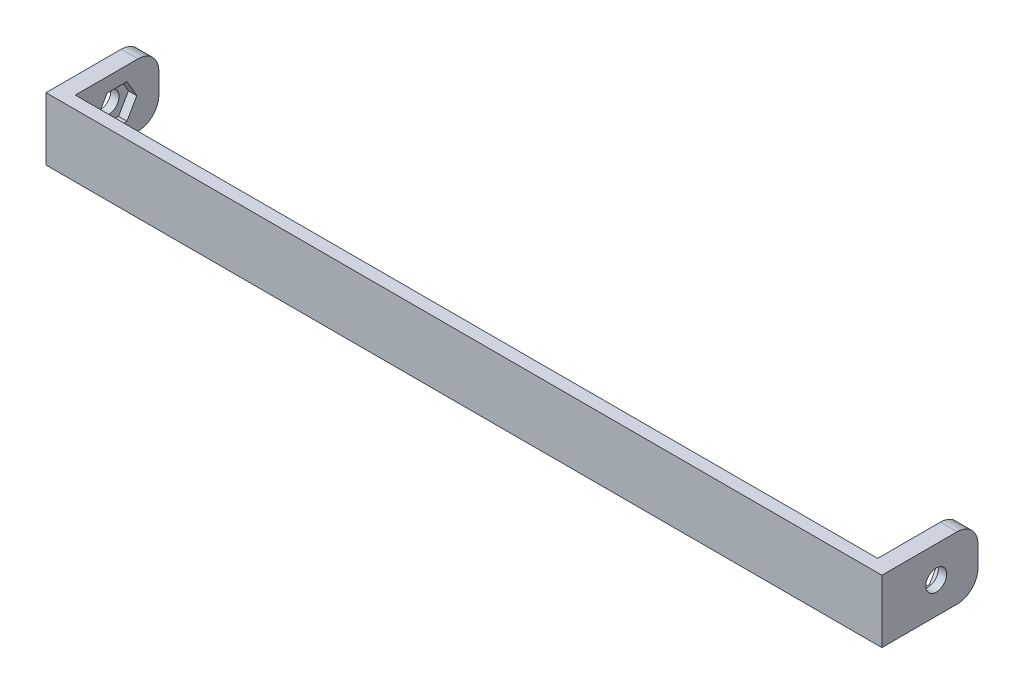
ISO-10303-21;
HEADER;
FILE_DESCRIPTION(('STEP AP214'),'2;1');
FILE_NAME('part.step','',(''),(''),'','','');
FILE_SCHEMA(('AUTOMOTIVE_DESIGN { 1 0 10303 214 1 1 1 1 }'));
ENDSEC;
DATA;
#1=APPLICATION_CONTEXT('core data for automotive mechanical design processes');
#2=APPLICATION_PROTOCOL_DEFINITION('international standard','automotive_design',2000,#1);
#3=PRODUCT_CONTEXT('',#1,'mechanical');
#4=PRODUCT('Part','Part','',(#3));
#5=PRODUCT_RELATED_PRODUCT_CATEGORY('part','',(#4));
#6=PRODUCT_DEFINITION_FORMATION('','',#4);
#7=PRODUCT_DEFINITION_CONTEXT('part definition',#1,'design');
#8=PRODUCT_DEFINITION('design','',#6,#7);
#9=PRODUCT_DEFINITION_SHAPE('','',#8);
#10=(LENGTH_UNIT() NAMED_UNIT(*) SI_UNIT(.MILLI.,.METRE.));
#11=(NAMED_UNIT(*) PLANE_ANGLE_UNIT() SI_UNIT($,.RADIAN.));
#12=(NAMED_UNIT(*) SI_UNIT($,.STERADIAN.) SOLID_ANGLE_UNIT());
#13=UNCERTAINTY_MEASURE_WITH_UNIT(LENGTH_MEASURE(1.E-05),#10,'distance_accuracy_value','');
#14=(GEOMETRIC_REPRESENTATION_CONTEXT(3) GLOBAL_UNCERTAINTY_ASSIGNED_CONTEXT((#13)) GLOBAL_UNIT_ASSIGNED_CONTEXT((#10,
#11,#12)) REPRESENTATION_CONTEXT('',''));
#15=CARTESIAN_POINT('',(0.,0.,0.));
#16=DIRECTION('',(0.,0.,1.));
#17=DIRECTION('',(1.,0.,0.));
#18=AXIS2_PLACEMENT_3D('',#15,#16,#17);
#19=CARTESIAN_POINT('',(-96.,9.86400779461241,-20.));
#20=DIRECTION('',(1.,0.,0.));
#21=DIRECTION('',(0.,1.,0.));
#22=AXIS2_PLACEMENT_3D('',#19,#20,#21);
#23=PLANE('',#22);
#24=DIRECTION('',(0.,0.,1.));
#25=VECTOR('',#24,1.);
#26=CARTESIAN_POINT('',(-96.,-7.5,-20.));
#27=LINE('',#26,#25);
#28=CARTESIAN_POINT('',(-96.,-7.5,-15.));
#29=VERTEX_POINT('',#28);
#30=CARTESIAN_POINT('',(-96.,-7.5,0.));
#31=VERTEX_POINT('',#30);
#32=EDGE_CURVE('E419',#29,#31,#27,.T.);
#33=ORIENTED_EDGE('',*,*,#32,.F.);
#34=CARTESIAN_POINT('',(-96.,-2.5,-15.));
#35=DIRECTION('',(1.,0.,0.));
#36=DIRECTION('',(0.,1.,0.));
#37=AXIS2_PLACEMENT_3D('',#34,#35,#36);
#38=CIRCLE('',#37,5.);
#39=CARTESIAN_POINT('',(-96.,-2.5,-20.));
#40=VERTEX_POINT('',#39);
#41=EDGE_CURVE('E496',#29,#40,#38,.T.);
#42=ORIENTED_EDGE('',*,*,#41,.T.);
#43=DIRECTION('',(0.,1.,0.));
#44=VECTOR('',#43,1.);
#45=CARTESIAN_POINT('',(-96.,9.86400779461241,-20.));
#46=LINE('',#45,#44);
#47=CARTESIAN_POINT('',(-96.,2.5,-20.));
#48=VERTEX_POINT('',#47);
#49=EDGE_CURVE('E409',#40,#48,#46,.T.);
#50=ORIENTED_EDGE('',*,*,#49,.T.);
#51=CARTESIAN_POINT('',(-96.,2.5,-15.));
#52=DIRECTION('',(1.,0.,0.));
#53=DIRECTION('',(0.,1.,0.));
#54=AXIS2_PLACEMENT_3D('',#51,#52,#53);
#55=CIRCLE('',#54,5.);
#56=CARTESIAN_POINT('',(-96.,7.5,-15.));
#57=VERTEX_POINT('',#56);
#58=EDGE_CURVE('E493',#48,#57,#55,.T.);
#59=ORIENTED_EDGE('',*,*,#58,.T.);
#60=DIRECTION('',(0.,0.,1.));
#61=VECTOR('',#60,1.);
#62=CARTESIAN_POINT('',(-96.,7.5,-20.));
#63=LINE('',#62,#61);
#64=CARTESIAN_POINT('',(-96.,7.5,0.));
#65=VERTEX_POINT('',#64);
#66=EDGE_CURVE('E413',#57,#65,#63,.T.);
#67=ORIENTED_EDGE('',*,*,#66,.T.);
#68=DIRECTION('',(0.,1.,0.));
#69=VECTOR('',#68,1.);
#70=CARTESIAN_POINT('',(-96.,9.86400779461241,0.));
#71=LINE('',#70,#69);
#72=EDGE_CURVE('E402',#31,#65,#71,.T.);
#73=ORIENTED_EDGE('',*,*,#72,.F.);
#74=EDGE_LOOP('',(#33,#42,#50,#59,#67,#73));
#75=FACE_BOUND('',#74,.T.);
#76=DIRECTION('',(0.,-0.866025403784439,0.5));
#77=VECTOR('',#76,1.);
#78=CARTESIAN_POINT('',(-96.,-2.22647023999251,-13.4488190149526));
#79=LINE('',#78,#77);
#80=CARTESIAN_POINT('',(-96.,0.,-14.7342722073549));
#81=VERTEX_POINT('',#80);
#82=CARTESIAN_POINT('',(-96.,-4.1,-12.3671361036775));
#83=VERTEX_POINT('',#82);
#84=EDGE_CURVE('E285',#81,#83,#79,.T.);
#85=ORIENTED_EDGE('',*,*,#84,.T.);
#86=DIRECTION('',(0.,0.,1.));
#87=VECTOR('',#86,1.);
#88=CARTESIAN_POINT('',(-96.,-4.1,-10.));
#89=LINE('',#88,#87);
#90=CARTESIAN_POINT('',(-96.,-4.1,-7.63286389632254));
#91=VERTEX_POINT('',#90);
#92=EDGE_CURVE('E235',#83,#91,#89,.T.);
#93=ORIENTED_EDGE('',*,*,#92,.T.);
#94=DIRECTION('',(0.,0.866025403784438,0.5));
#95=VECTOR('',#94,1.);
#96=CARTESIAN_POINT('',(-96.,-1.87352976000753,-6.34741070392018));
#97=LINE('',#96,#95);
#98=CARTESIAN_POINT('',(-96.,0.,-5.26572779264507));
#99=VERTEX_POINT('',#98);
#100=EDGE_CURVE('E259',#91,#99,#97,.T.);
#101=ORIENTED_EDGE('',*,*,#100,.T.);
#102=DIRECTION('',(0.,0.866025403784439,-0.5));
#103=VECTOR('',#102,1.);
#104=CARTESIAN_POINT('',(-96.,2.22647023999246,-6.55118098504742));
#105=LINE('',#104,#103);
#106=CARTESIAN_POINT('',(-96.,4.1,-7.63286389632254));
#107=VERTEX_POINT('',#106);
#108=EDGE_CURVE('E37',#99,#107,#105,.T.);
#109=ORIENTED_EDGE('',*,*,#108,.T.);
#110=DIRECTION('',(0.,0.,-1.));
#111=VECTOR('',#110,1.);
#112=CARTESIAN_POINT('',(-96.,4.1,-10.));
#113=LINE('',#112,#111);
#114=CARTESIAN_POINT('',(-96.,4.1,-12.3671361036775));
#115=VERTEX_POINT('',#114);
#116=EDGE_CURVE('E292',#107,#115,#113,.T.);
#117=ORIENTED_EDGE('',*,*,#116,.T.);
#118=DIRECTION('',(0.,-0.866025403784438,-0.5));
#119=VECTOR('',#118,1.);
#120=CARTESIAN_POINT('',(-96.,1.87352976000749,-13.6525892960798));
#121=LINE('',#120,#119);
#122=EDGE_CURVE('E288',#115,#81,#121,.T.);
#123=ORIENTED_EDGE('',*,*,#122,.T.);
#124=EDGE_LOOP('',(#85,#93,#101,#109,#117,#123));
#125=FACE_BOUND('',#124,.T.);
#126=ADVANCED_FACE('F16',(#75,#125),#23,.T.);
#127=CARTESIAN_POINT('',(96.,9.86400779461243,-20.));
#128=DIRECTION('',(1.,0.,0.));
#129=DIRECTION('',(0.,1.,0.));
#130=AXIS2_PLACEMENT_3D('',#127,#128,#129);
#131=PLANE('',#130);
#132=DIRECTION('',(0.,0.,1.));
#133=VECTOR('',#132,1.);
#134=CARTESIAN_POINT('',(96.,7.5,-20.));
#135=LINE('',#134,#133);
#136=CARTESIAN_POINT('',(96.,7.5,-15.));
#137=VERTEX_POINT('',#136);
#138=CARTESIAN_POINT('',(96.,7.5,0.));
#139=VERTEX_POINT('',#138);
#140=EDGE_CURVE('E399',#137,#139,#135,.T.);
#141=ORIENTED_EDGE('',*,*,#140,.F.);
#142=CARTESIAN_POINT('',(96.,2.5,-15.));
#143=DIRECTION('',(1.,0.,0.));
#144=DIRECTION('',(0.,1.,0.));
#145=AXIS2_PLACEMENT_3D('',#142,#143,#144);
#146=CIRCLE('',#145,5.);
#147=CARTESIAN_POINT('',(96.,2.5,-20.));
#148=VERTEX_POINT('',#147);
#149=EDGE_CURVE('E470',#137,#148,#146,.F.);
#150=ORIENTED_EDGE('',*,*,#149,.T.);
#151=DIRECTION('',(0.,1.,0.));
#152=VECTOR('',#151,1.);
#153=CARTESIAN_POINT('',(96.,9.86400779461243,-20.));
#154=LINE('',#153,#152);
#155=CARTESIAN_POINT('',(96.,-2.5,-20.));
#156=VERTEX_POINT('',#155);
#157=EDGE_CURVE('E387',#156,#148,#154,.T.);
#158=ORIENTED_EDGE('',*,*,#157,.F.);
#159=CARTESIAN_POINT('',(96.,-2.5,-15.));
#160=DIRECTION('',(1.,0.,0.));
#161=DIRECTION('',(0.,1.,0.));
#162=AXIS2_PLACEMENT_3D('',#159,#160,#161);
#163=CIRCLE('',#162,5.);
#164=CARTESIAN_POINT('',(96.,-7.5,-15.));
#165=VERTEX_POINT('',#164);
#166=EDGE_CURVE('E467',#156,#165,#163,.F.);
#167=ORIENTED_EDGE('',*,*,#166,.T.);
#168=DIRECTION('',(0.,0.,1.));
#169=VECTOR('',#168,1.);
#170=CARTESIAN_POINT('',(96.,-7.5,-20.));
#171=LINE('',#170,#169);
#172=CARTESIAN_POINT('',(96.,-7.5,0.));
#173=VERTEX_POINT('',#172);
#174=EDGE_CURVE('E395',#165,#173,#171,.T.);
#175=ORIENTED_EDGE('',*,*,#174,.T.);
#176=DIRECTION('',(0.,1.,0.));
#177=VECTOR('',#176,1.);
#178=CARTESIAN_POINT('',(96.,9.86400779461243,0.));
#179=LINE('',#178,#177);
#180=EDGE_CURVE('E386',#173,#139,#179,.T.);
#181=ORIENTED_EDGE('',*,*,#180,.T.);
#182=EDGE_LOOP('',(#141,#150,#158,#167,#175,#181));
#183=FACE_BOUND('',#182,.T.);
#184=DIRECTION('',(0.,0.,-1.));
#185=VECTOR('',#184,1.);
#186=CARTESIAN_POINT('',(96.,-4.09999999999993,-10.));
#187=LINE('',#186,#185);
#188=CARTESIAN_POINT('',(96.,-4.09999999999993,-7.63286389632254));
#189=VERTEX_POINT('',#188);
#190=CARTESIAN_POINT('',(96.,-4.09999999999993,-12.3671361036775));
#191=VERTEX_POINT('',#190);
#192=EDGE_CURVE('E240',#189,#191,#187,.T.);
#193=ORIENTED_EDGE('',*,*,#192,.T.);
#194=DIRECTION('',(0.,0.866025403784439,-0.5));
#195=VECTOR('',#194,1.);
#196=CARTESIAN_POINT('',(96.,-2.04999999999993,-13.5507041555162));
#197=LINE('',#196,#195);
#198=CARTESIAN_POINT('',(96.,0.,-14.7342722073549));
#199=VERTEX_POINT('',#198);
#200=EDGE_CURVE('E316',#191,#199,#197,.T.);
#201=ORIENTED_EDGE('',*,*,#200,.T.);
#202=DIRECTION('',(0.,0.866025403784439,0.5));
#203=VECTOR('',#202,1.);
#204=CARTESIAN_POINT('',(96.,2.05000000000007,-13.5507041555162));
#205=LINE('',#204,#203);
#206=CARTESIAN_POINT('',(96.,4.10000000000007,-12.3671361036775));
#207=VERTEX_POINT('',#206);
#208=EDGE_CURVE('E49',#199,#207,#205,.T.);
#209=ORIENTED_EDGE('',*,*,#208,.T.);
#210=DIRECTION('',(0.,0.,1.));
#211=VECTOR('',#210,1.);
#212=CARTESIAN_POINT('',(96.,4.10000000000007,-10.));
#213=LINE('',#212,#211);
#214=CARTESIAN_POINT('',(96.,4.10000000000008,-7.63286389632254));
#215=VERTEX_POINT('',#214);
#216=EDGE_CURVE('E352',#207,#215,#213,.T.);
#217=ORIENTED_EDGE('',*,*,#216,.T.);
#218=DIRECTION('',(0.,-0.866025403784438,0.5));
#219=VECTOR('',#218,1.);
#220=CARTESIAN_POINT('',(96.,2.05000000000008,-6.4492958444838));
#221=LINE('',#220,#219);
#222=CARTESIAN_POINT('',(96.,0.,-5.26572779264507));
#223=VERTEX_POINT('',#222);
#224=EDGE_CURVE('E348',#215,#223,#221,.T.);
#225=ORIENTED_EDGE('',*,*,#224,.T.);
#226=DIRECTION('',(0.,-0.866025403784439,-0.5));
#227=VECTOR('',#226,1.);
#228=CARTESIAN_POINT('',(96.,-2.04999999999993,-6.4492958444838));
#229=LINE('',#228,#227);
#230=EDGE_CURVE('E344',#223,#189,#229,.T.);
#231=ORIENTED_EDGE('',*,*,#230,.T.);
#232=EDGE_LOOP('',(#193,#201,#209,#217,#225,#231));
#233=FACE_BOUND('',#232,.T.);
#234=ADVANCED_FACE('F533',(#183,#233),#131,.F.);
#235=CARTESIAN_POINT('',(-101.886199686838,0.,-10.));
#236=DIRECTION('',(1.,0.,0.));
#237=DIRECTION('',(0.,1.,0.));
#238=AXIS2_PLACEMENT_3D('',#235,#236,#237);
#239=CYLINDRICAL_SURFACE('',#238,2.5);
#240=CARTESIAN_POINT('',(100.,0.,-10.));
#241=DIRECTION('',(1.,0.,0.));
#242=DIRECTION('',(0.,1.,0.));
#243=AXIS2_PLACEMENT_3D('',#240,#241,#242);
#244=CIRCLE('',#243,2.5);
#245=CARTESIAN_POINT('',(100.,2.50000000000002,-10.));
#246=VERTEX_POINT('',#245);
#247=EDGE_CURVE('E378',#246,#246,#244,.T.);
#248=ORIENTED_EDGE('',*,*,#247,.T.);
#249=EDGE_LOOP('',(#248));
#250=FACE_BOUND('',#249,.T.);
#251=CARTESIAN_POINT('',(98.,0.,-10.));
#252=DIRECTION('',(1.,0.,0.));
#253=DIRECTION('',(0.,1.,0.));
#254=AXIS2_PLACEMENT_3D('',#251,#252,#253);
#255=CIRCLE('',#254,2.5);
#256=CARTESIAN_POINT('',(98.,2.50000000000002,-10.));
#257=VERTEX_POINT('',#256);
#258=EDGE_CURVE('E336',#257,#257,#255,.T.);
#259=ORIENTED_EDGE('',*,*,#258,.F.);
#260=EDGE_LOOP('',(#259));
#261=FACE_BOUND('',#260,.T.);
#262=ADVANCED_FACE('F578',(#250,#261),#239,.F.);
#263=CARTESIAN_POINT('',(0.,0.,0.));
#264=DIRECTION('',(0.,0.,1.));
#265=DIRECTION('',(1.,0.,0.));
#266=AXIS2_PLACEMENT_3D('',#263,#264,#265);
#267=PLANE('',#266);
#268=ORIENTED_EDGE('',*,*,#180,.F.);
#269=DIRECTION('',(1.,0.,0.));
#270=VECTOR('',#269,1.);
#271=CARTESIAN_POINT('',(0.,-7.5,0.));
#272=LINE('',#271,#270);
#273=EDGE_CURVE('E428',#31,#173,#272,.T.);
#274=ORIENTED_EDGE('',*,*,#273,.F.);
#275=ORIENTED_EDGE('',*,*,#72,.T.);
#276=DIRECTION('',(1.,0.,0.));
#277=VECTOR('',#276,1.);
#278=CARTESIAN_POINT('',(0.,7.5,0.));
#279=LINE('',#278,#277);
#280=EDGE_CURVE('E422',#65,#139,#279,.T.);
#281=ORIENTED_EDGE('',*,*,#280,.T.);
#282=EDGE_LOOP('',(#268,#274,#275,#281));
#283=FACE_BOUND('',#282,.T.);
#284=ADVANCED_FACE('F530',(#283),#267,.F.);
#285=CARTESIAN_POINT('',(0.,7.5,3.));
#286=DIRECTION('',(0.,1.,0.));
#287=DIRECTION('',(-1.,0.,0.));
#288=AXIS2_PLACEMENT_3D('',#285,#286,#287);
#289=PLANE('',#288);
#290=DIRECTION('',(0.,0.,-1.));
#291=VECTOR('',#290,1.);
#292=CARTESIAN_POINT('',(100.,7.5,3.));
#293=LINE('',#292,#291);
#294=CARTESIAN_POINT('',(100.,7.5,3.));
#295=VERTEX_POINT('',#294);
#296=CARTESIAN_POINT('',(100.,7.5,-15.));
#297=VERTEX_POINT('',#296);
#298=EDGE_CURVE('E438',#295,#297,#293,.T.);
#299=ORIENTED_EDGE('',*,*,#298,.T.);
#300=DIRECTION('',(-1.,0.,0.));
#301=VECTOR('',#300,1.);
#302=CARTESIAN_POINT('',(96.,7.5,-15.));
#303=LINE('',#302,#301);
#304=EDGE_CURVE('E463',#297,#137,#303,.T.);
#305=ORIENTED_EDGE('',*,*,#304,.T.);
#306=ORIENTED_EDGE('',*,*,#140,.T.);
#307=ORIENTED_EDGE('',*,*,#280,.F.);
#308=ORIENTED_EDGE('',*,*,#66,.F.);
#309=DIRECTION('',(1.,0.,0.));
#310=VECTOR('',#309,1.);
#311=CARTESIAN_POINT('',(-100.,7.5,-15.));
#312=LINE('',#311,#310);
#313=CARTESIAN_POINT('',(-100.,7.5,-15.));
#314=VERTEX_POINT('',#313);
#315=EDGE_CURVE('E457',#57,#314,#312,.F.);
#316=ORIENTED_EDGE('',*,*,#315,.T.);
#317=DIRECTION('',(0.,0.,-1.));
#318=VECTOR('',#317,1.);
#319=CARTESIAN_POINT('',(-100.,7.5,3.));
#320=LINE('',#319,#318);
#321=CARTESIAN_POINT('',(-100.,7.5,3.));
#322=VERTEX_POINT('',#321);
#323=EDGE_CURVE('E453',#322,#314,#320,.T.);
#324=ORIENTED_EDGE('',*,*,#323,.F.);
#325=DIRECTION('',(1.,0.,0.));
#326=VECTOR('',#325,1.);
#327=CARTESIAN_POINT('',(0.,7.5,3.));
#328=LINE('',#327,#326);
#329=EDGE_CURVE('E423',#322,#295,#328,.T.);
#330=ORIENTED_EDGE('',*,*,#329,.T.);
#331=EDGE_LOOP('',(#299,#305,#306,#307,#308,#316,#324,#330));
#332=FACE_BOUND('',#331,.T.);
#333=ADVANCED_FACE('F526',(#332),#289,.T.);
#334=CARTESIAN_POINT('',(-100.,9.86400779461242,3.));
#335=DIRECTION('',(-1.,0.,0.));
#336=DIRECTION('',(0.,0.,1.));
#337=AXIS2_PLACEMENT_3D('',#334,#335,#336);
#338=PLANE('',#337);
#339=CARTESIAN_POINT('',(-100.,0.,-10.));
#340=DIRECTION('',(-1.,0.,0.));
#341=DIRECTION('',(0.,0.,1.));
#342=AXIS2_PLACEMENT_3D('',#339,#340,#341);
#343=CIRCLE('',#342,2.5);
#344=CARTESIAN_POINT('',(-100.,0.,-7.5));
#345=VERTEX_POINT('',#344);
#346=EDGE_CURVE('E382',#345,#345,#343,.T.);
#347=ORIENTED_EDGE('',*,*,#346,.F.);
#348=EDGE_LOOP('',(#347));
#349=FACE_BOUND('',#348,.T.);
#350=DIRECTION('',(0.,1.,0.));
#351=VECTOR('',#350,1.);
#352=CARTESIAN_POINT('',(-100.,9.86400779461242,-20.));
#353=LINE('',#352,#351);
#354=CARTESIAN_POINT('',(-100.,-2.5,-20.));
#355=VERTEX_POINT('',#354);
#356=CARTESIAN_POINT('',(-100.,2.5,-20.));
#357=VERTEX_POINT('',#356);
#358=EDGE_CURVE('E405',#355,#357,#353,.T.);
#359=ORIENTED_EDGE('',*,*,#358,.F.);
#360=CARTESIAN_POINT('',(-100.,-2.5,-15.));
#361=DIRECTION('',(-1.,0.,0.));
#362=DIRECTION('',(0.,0.,1.));
#363=AXIS2_PLACEMENT_3D('',#360,#361,#362);
#364=CIRCLE('',#363,5.);
#365=CARTESIAN_POINT('',(-100.,-7.5,-15.));
#366=VERTEX_POINT('',#365);
#367=EDGE_CURVE('E10',#355,#366,#364,.T.);
#368=ORIENTED_EDGE('',*,*,#367,.T.);
#369=DIRECTION('',(0.,0.,-1.));
#370=VECTOR('',#369,1.);
#371=CARTESIAN_POINT('',(-100.,-7.5,3.));
#372=LINE('',#371,#370);
#373=CARTESIAN_POINT('',(-100.,-7.5,3.));
#374=VERTEX_POINT('',#373);
#375=EDGE_CURVE('E452',#374,#366,#372,.T.);
#376=ORIENTED_EDGE('',*,*,#375,.F.);
#377=DIRECTION('',(0.,1.,0.));
#378=VECTOR('',#377,1.);
#379=CARTESIAN_POINT('',(-100.,9.86400779461242,3.));
#380=LINE('',#379,#378);
#381=EDGE_CURVE('E431',#374,#322,#380,.T.);
#382=ORIENTED_EDGE('',*,*,#381,.T.);
#383=ORIENTED_EDGE('',*,*,#323,.T.);
#384=CARTESIAN_POINT('',(-100.,2.5,-15.));
#385=DIRECTION('',(-1.,0.,0.));
#386=DIRECTION('',(0.,0.,1.));
#387=AXIS2_PLACEMENT_3D('',#384,#385,#386);
#388=CIRCLE('',#387,5.);
#389=EDGE_CURVE('E25',#314,#357,#388,.T.);
#390=ORIENTED_EDGE('',*,*,#389,.T.);
#391=EDGE_LOOP('',(#359,#368,#376,#382,#383,#390));
#392=FACE_BOUND('',#391,.T.);
#393=ADVANCED_FACE('F510',(#349,#392),#338,.T.);
#394=CARTESIAN_POINT('',(0.,-7.5,3.));
#395=DIRECTION('',(0.,1.,0.));
#396=DIRECTION('',(-1.,0.,0.));
#397=AXIS2_PLACEMENT_3D('',#394,#395,#396);
#398=PLANE('',#397);
#399=ORIENTED_EDGE('',*,*,#174,.F.);
#400=DIRECTION('',(-1.,0.,0.));
#401=VECTOR('',#400,1.);
#402=CARTESIAN_POINT('',(0.,-7.5,-15.));
#403=LINE('',#402,#401);
#404=CARTESIAN_POINT('',(100.,-7.5,-15.));
#405=VERTEX_POINT('',#404);
#406=EDGE_CURVE('E490',#165,#405,#403,.F.);
#407=ORIENTED_EDGE('',*,*,#406,.T.);
#408=DIRECTION('',(0.,0.,-1.));
#409=VECTOR('',#408,1.);
#410=CARTESIAN_POINT('',(100.,-7.5,3.));
#411=LINE('',#410,#409);
#412=CARTESIAN_POINT('',(100.,-7.5,3.));
#413=VERTEX_POINT('',#412);
#414=EDGE_CURVE('E448',#413,#405,#411,.T.);
#415=ORIENTED_EDGE('',*,*,#414,.F.);
#416=DIRECTION('',(1.,0.,0.));
#417=VECTOR('',#416,1.);
#418=CARTESIAN_POINT('',(0.,-7.5,3.));
#419=LINE('',#418,#417);
#420=EDGE_CURVE('E427',#374,#413,#419,.T.);
#421=ORIENTED_EDGE('',*,*,#420,.F.);
#422=ORIENTED_EDGE('',*,*,#375,.T.);
#423=DIRECTION('',(1.,0.,0.));
#424=VECTOR('',#423,1.);
#425=CARTESIAN_POINT('',(0.,-7.5,-15.));
#426=LINE('',#425,#424);
#427=EDGE_CURVE('E486',#366,#29,#426,.T.);
#428=ORIENTED_EDGE('',*,*,#427,.T.);
#429=ORIENTED_EDGE('',*,*,#32,.T.);
#430=ORIENTED_EDGE('',*,*,#273,.T.);
#431=EDGE_LOOP('',(#399,#407,#415,#421,#422,#428,#429,#430));
#432=FACE_BOUND('',#431,.T.);
#433=ADVANCED_FACE('F539',(#432),#398,.F.);
#434=CARTESIAN_POINT('',(100.,9.86400779461242,3.));
#435=DIRECTION('',(-1.,0.,0.));
#436=DIRECTION('',(0.,-1.,0.));
#437=AXIS2_PLACEMENT_3D('',#434,#435,#436);
#438=PLANE('',#437);
#439=ORIENTED_EDGE('',*,*,#247,.F.);
#440=EDGE_LOOP('',(#439));
#441=FACE_BOUND('',#440,.T.);
#442=DIRECTION('',(0.,1.,0.));
#443=VECTOR('',#442,1.);
#444=CARTESIAN_POINT('',(100.,9.86400779461242,-20.));
#445=LINE('',#444,#443);
#446=CARTESIAN_POINT('',(100.,-2.5,-20.));
#447=VERTEX_POINT('',#446);
#448=CARTESIAN_POINT('',(100.,2.5,-20.));
#449=VERTEX_POINT('',#448);
#450=EDGE_CURVE('E391',#447,#449,#445,.T.);
#451=ORIENTED_EDGE('',*,*,#450,.T.);
#452=CARTESIAN_POINT('',(100.,2.5,-15.));
#453=DIRECTION('',(-1.,0.,0.));
#454=DIRECTION('',(0.,-1.,0.));
#455=AXIS2_PLACEMENT_3D('',#452,#453,#454);
#456=CIRCLE('',#455,5.);
#457=EDGE_CURVE('E483',#449,#297,#456,.F.);
#458=ORIENTED_EDGE('',*,*,#457,.T.);
#459=ORIENTED_EDGE('',*,*,#298,.F.);
#460=DIRECTION('',(0.,1.,0.));
#461=VECTOR('',#460,1.);
#462=CARTESIAN_POINT('',(100.,9.86400779461242,3.));
#463=LINE('',#462,#461);
#464=EDGE_CURVE('E435',#413,#295,#463,.T.);
#465=ORIENTED_EDGE('',*,*,#464,.F.);
#466=ORIENTED_EDGE('',*,*,#414,.T.);
#467=CARTESIAN_POINT('',(100.,-2.5,-15.));
#468=DIRECTION('',(-1.,0.,0.));
#469=DIRECTION('',(0.,-1.,0.));
#470=AXIS2_PLACEMENT_3D('',#467,#468,#469);
#471=CIRCLE('',#470,5.);
#472=EDGE_CURVE('E480',#405,#447,#471,.F.);
#473=ORIENTED_EDGE('',*,*,#472,.T.);
#474=EDGE_LOOP('',(#451,#458,#459,#465,#466,#473));
#475=FACE_BOUND('',#474,.T.);
#476=ADVANCED_FACE('F547',(#441,#475),#438,.F.);
#477=CARTESIAN_POINT('',(0.,0.,3.));
#478=DIRECTION('',(0.,0.,1.));
#479=DIRECTION('',(1.,0.,0.));
#480=AXIS2_PLACEMENT_3D('',#477,#478,#479);
#481=PLANE('',#480);
#482=ORIENTED_EDGE('',*,*,#329,.F.);
#483=ORIENTED_EDGE('',*,*,#381,.F.);
#484=ORIENTED_EDGE('',*,*,#420,.T.);
#485=ORIENTED_EDGE('',*,*,#464,.T.);
#486=EDGE_LOOP('',(#482,#483,#484,#485));
#487=FACE_BOUND('',#486,.T.);
#488=ADVANCED_FACE('F560',(#487),#481,.T.);
#489=CARTESIAN_POINT('',(0.,0.,-20.));
#490=DIRECTION('',(0.,0.,1.));
#491=DIRECTION('',(1.,0.,0.));
#492=AXIS2_PLACEMENT_3D('',#489,#490,#491);
#493=PLANE('',#492);
#494=ORIENTED_EDGE('',*,*,#49,.F.);
#495=DIRECTION('',(1.,0.,0.));
#496=VECTOR('',#495,1.);
#497=CARTESIAN_POINT('',(0.,-2.5,-20.));
#498=LINE('',#497,#496);
#499=EDGE_CURVE('E503',#40,#355,#498,.F.);
#500=ORIENTED_EDGE('',*,*,#499,.T.);
#501=ORIENTED_EDGE('',*,*,#358,.T.);
#502=DIRECTION('',(1.,0.,0.));
#503=VECTOR('',#502,1.);
#504=CARTESIAN_POINT('',(-96.,2.5,-20.));
#505=LINE('',#504,#503);
#506=EDGE_CURVE('E499',#357,#48,#505,.T.);
#507=ORIENTED_EDGE('',*,*,#506,.T.);
#508=EDGE_LOOP('',(#494,#500,#501,#507));
#509=FACE_BOUND('',#508,.T.);
#510=ADVANCED_FACE('F517',(#509),#493,.F.);
#511=CARTESIAN_POINT('',(0.,0.,-20.));
#512=DIRECTION('',(0.,0.,1.));
#513=DIRECTION('',(1.,0.,0.));
#514=AXIS2_PLACEMENT_3D('',#511,#512,#513);
#515=PLANE('',#514);
#516=ORIENTED_EDGE('',*,*,#157,.T.);
#517=DIRECTION('',(-1.,0.,0.));
#518=VECTOR('',#517,1.);
#519=CARTESIAN_POINT('',(100.,2.5,-20.));
#520=LINE('',#519,#518);
#521=EDGE_CURVE('E477',#148,#449,#520,.F.);
#522=ORIENTED_EDGE('',*,*,#521,.T.);
#523=ORIENTED_EDGE('',*,*,#450,.F.);
#524=DIRECTION('',(-1.,0.,0.));
#525=VECTOR('',#524,1.);
#526=CARTESIAN_POINT('',(0.,-2.5,-20.));
#527=LINE('',#526,#525);
#528=EDGE_CURVE('E473',#447,#156,#527,.T.);
#529=ORIENTED_EDGE('',*,*,#528,.T.);
#530=EDGE_LOOP('',(#516,#522,#523,#529));
#531=FACE_BOUND('',#530,.T.);
#532=ADVANCED_FACE('F551',(#531),#515,.F.);
#533=CARTESIAN_POINT('',(0.,2.5,-15.));
#534=DIRECTION('',(1.,0.,0.));
#535=DIRECTION('',(0.,1.,0.));
#536=AXIS2_PLACEMENT_3D('',#533,#534,#535);
#537=CYLINDRICAL_SURFACE('',#536,5.);
#538=ORIENTED_EDGE('',*,*,#457,.F.);
#539=ORIENTED_EDGE('',*,*,#521,.F.);
#540=ORIENTED_EDGE('',*,*,#149,.F.);
#541=ORIENTED_EDGE('',*,*,#304,.F.);
#542=EDGE_LOOP('',(#538,#539,#540,#541));
#543=FACE_BOUND('',#542,.T.);
#544=ADVANCED_FACE('F554',(#543),#537,.T.);
#545=CARTESIAN_POINT('',(0.,-2.5,-15.));
#546=DIRECTION('',(-1.,0.,0.));
#547=DIRECTION('',(0.,-1.,0.));
#548=AXIS2_PLACEMENT_3D('',#545,#546,#547);
#549=CYLINDRICAL_SURFACE('',#548,5.);
#550=ORIENTED_EDGE('',*,*,#472,.F.);
#551=ORIENTED_EDGE('',*,*,#406,.F.);
#552=ORIENTED_EDGE('',*,*,#166,.F.);
#553=ORIENTED_EDGE('',*,*,#528,.F.);
#554=EDGE_LOOP('',(#550,#551,#552,#553));
#555=FACE_BOUND('',#554,.T.);
#556=ADVANCED_FACE('F543',(#555),#549,.T.);
#557=CARTESIAN_POINT('',(0.,-2.5,-15.));
#558=DIRECTION('',(1.,0.,0.));
#559=DIRECTION('',(0.,1.,0.));
#560=AXIS2_PLACEMENT_3D('',#557,#558,#559);
#561=CYLINDRICAL_SURFACE('',#560,5.);
#562=ORIENTED_EDGE('',*,*,#367,.F.);
#563=ORIENTED_EDGE('',*,*,#499,.F.);
#564=ORIENTED_EDGE('',*,*,#41,.F.);
#565=ORIENTED_EDGE('',*,*,#427,.F.);
#566=EDGE_LOOP('',(#562,#563,#564,#565));
#567=FACE_BOUND('',#566,.T.);
#568=ADVANCED_FACE('F564',(#567),#561,.T.);
#569=CARTESIAN_POINT('',(0.,2.5,-15.));
#570=DIRECTION('',(-1.,0.,0.));
#571=DIRECTION('',(0.,-1.,0.));
#572=AXIS2_PLACEMENT_3D('',#569,#570,#571);
#573=CYLINDRICAL_SURFACE('',#572,5.);
#574=ORIENTED_EDGE('',*,*,#389,.F.);
#575=ORIENTED_EDGE('',*,*,#315,.F.);
#576=ORIENTED_EDGE('',*,*,#58,.F.);
#577=ORIENTED_EDGE('',*,*,#506,.F.);
#578=EDGE_LOOP('',(#574,#575,#576,#577));
#579=FACE_BOUND('',#578,.T.);
#580=ADVANCED_FACE('F18',(#579),#573,.T.);
#581=CARTESIAN_POINT('',(-98.,0.,-10.));
#582=DIRECTION('',(1.,0.,0.));
#583=DIRECTION('',(0.,1.,0.));
#584=AXIS2_PLACEMENT_3D('',#581,#582,#583);
#585=CIRCLE('',#584,2.5);
#586=CARTESIAN_POINT('',(-98.,2.49999999999998,-10.));
#587=VERTEX_POINT('',#586);
#588=EDGE_CURVE('E279',#587,#587,#585,.T.);
#589=ORIENTED_EDGE('',*,*,#588,.T.);
#590=EDGE_LOOP('',(#589));
#591=FACE_BOUND('',#590,.T.);
#592=ORIENTED_EDGE('',*,*,#346,.T.);
#593=EDGE_LOOP('',(#592));
#594=FACE_BOUND('',#593,.T.);
#595=ADVANCED_FACE('F571',(#591,#594),#239,.F.);
#596=CARTESIAN_POINT('',(98.,-4.09999999999993,-10.));
#597=DIRECTION('',(0.,1.,0.));
#598=DIRECTION('',(-1.,0.,0.));
#599=AXIS2_PLACEMENT_3D('',#596,#597,#598);
#600=PLANE('',#599);
#601=ORIENTED_EDGE('',*,*,#192,.F.);
#602=DIRECTION('',(-1.,0.,0.));
#603=VECTOR('',#602,1.);
#604=CARTESIAN_POINT('',(98.,-4.09999999999993,-7.63286389632254));
#605=LINE('',#604,#603);
#606=CARTESIAN_POINT('',(98.,-4.09999999999993,-7.63286389632254));
#607=VERTEX_POINT('',#606);
#608=EDGE_CURVE('E375',#607,#189,#605,.T.);
#609=ORIENTED_EDGE('',*,*,#608,.F.);
#610=DIRECTION('',(0.,0.,-1.));
#611=VECTOR('',#610,1.);
#612=CARTESIAN_POINT('',(98.,-4.09999999999993,-10.));
#613=LINE('',#612,#611);
#614=CARTESIAN_POINT('',(98.,-4.09999999999993,-12.3671361036775));
#615=VERTEX_POINT('',#614);
#616=EDGE_CURVE('E311',#607,#615,#613,.T.);
#617=ORIENTED_EDGE('',*,*,#616,.T.);
#618=DIRECTION('',(-1.,0.,0.));
#619=VECTOR('',#618,1.);
#620=CARTESIAN_POINT('',(98.,-4.09999999999993,-12.3671361036775));
#621=LINE('',#620,#619);
#622=EDGE_CURVE('E340',#615,#191,#621,.T.);
#623=ORIENTED_EDGE('',*,*,#622,.T.);
#624=EDGE_LOOP('',(#601,#609,#617,#623));
#625=FACE_BOUND('',#624,.T.);
#626=ADVANCED_FACE('F607',(#625),#600,.T.);
#627=CARTESIAN_POINT('',(98.,-2.04999999999993,-6.4492958444838));
#628=DIRECTION('',(0.,0.5,-0.866025403784439));
#629=DIRECTION('',(0.,0.866025403784439,0.5));
#630=AXIS2_PLACEMENT_3D('',#627,#628,#629);
#631=PLANE('',#630);
#632=ORIENTED_EDGE('',*,*,#230,.F.);
#633=DIRECTION('',(-1.,0.,0.));
#634=VECTOR('',#633,1.);
#635=CARTESIAN_POINT('',(98.,0.,-5.26572779264507));
#636=LINE('',#635,#634);
#637=CARTESIAN_POINT('',(98.,0.,-5.26572779264507));
#638=VERTEX_POINT('',#637);
#639=EDGE_CURVE('E372',#638,#223,#636,.T.);
#640=ORIENTED_EDGE('',*,*,#639,.F.);
#641=DIRECTION('',(0.,-0.866025403784439,-0.5));
#642=VECTOR('',#641,1.);
#643=CARTESIAN_POINT('',(98.,-2.04999999999993,-6.4492958444838));
#644=LINE('',#643,#642);
#645=EDGE_CURVE('E315',#638,#607,#644,.T.);
#646=ORIENTED_EDGE('',*,*,#645,.T.);
#647=ORIENTED_EDGE('',*,*,#608,.T.);
#648=EDGE_LOOP('',(#632,#640,#646,#647));
#649=FACE_BOUND('',#648,.T.);
#650=ADVANCED_FACE('F611',(#649),#631,.T.);
#651=CARTESIAN_POINT('',(98.,2.05000000000008,-6.4492958444838));
#652=DIRECTION('',(0.,-0.5,-0.866025403784438));
#653=DIRECTION('',(0.,0.866025403784438,-0.5));
#654=AXIS2_PLACEMENT_3D('',#651,#652,#653);
#655=PLANE('',#654);
#656=ORIENTED_EDGE('',*,*,#224,.F.);
#657=DIRECTION('',(-1.,0.,0.));
#658=VECTOR('',#657,1.);
#659=CARTESIAN_POINT('',(98.,4.10000000000008,-7.63286389632254));
#660=LINE('',#659,#658);
#661=CARTESIAN_POINT('',(98.,4.10000000000008,-7.63286389632254));
#662=VERTEX_POINT('',#661);
#663=EDGE_CURVE('E369',#662,#215,#660,.T.);
#664=ORIENTED_EDGE('',*,*,#663,.F.);
#665=DIRECTION('',(0.,-0.866025403784438,0.5));
#666=VECTOR('',#665,1.);
#667=CARTESIAN_POINT('',(98.,2.05000000000008,-6.4492958444838));
#668=LINE('',#667,#666);
#669=EDGE_CURVE('E320',#662,#638,#668,.T.);
#670=ORIENTED_EDGE('',*,*,#669,.T.);
#671=ORIENTED_EDGE('',*,*,#639,.T.);
#672=EDGE_LOOP('',(#656,#664,#670,#671));
#673=FACE_BOUND('',#672,.T.);
#674=ADVANCED_FACE('F615',(#673),#655,.T.);
#675=CARTESIAN_POINT('',(98.,4.10000000000008,-10.));
#676=DIRECTION('',(0.,-1.,0.));
#677=DIRECTION('',(0.,0.,-1.));
#678=AXIS2_PLACEMENT_3D('',#675,#676,#677);
#679=PLANE('',#678);
#680=ORIENTED_EDGE('',*,*,#216,.F.);
#681=DIRECTION('',(-1.,0.,0.));
#682=VECTOR('',#681,1.);
#683=CARTESIAN_POINT('',(98.,4.10000000000007,-12.3671361036775));
#684=LINE('',#683,#682);
#685=CARTESIAN_POINT('',(98.,4.10000000000007,-12.3671361036775));
#686=VERTEX_POINT('',#685);
#687=EDGE_CURVE('E366',#686,#207,#684,.T.);
#688=ORIENTED_EDGE('',*,*,#687,.F.);
#689=DIRECTION('',(0.,0.,1.));
#690=VECTOR('',#689,1.);
#691=CARTESIAN_POINT('',(98.,4.10000000000008,-10.));
#692=LINE('',#691,#690);
#693=EDGE_CURVE('E324',#686,#662,#692,.T.);
#694=ORIENTED_EDGE('',*,*,#693,.T.);
#695=ORIENTED_EDGE('',*,*,#663,.T.);
#696=EDGE_LOOP('',(#680,#688,#694,#695));
#697=FACE_BOUND('',#696,.T.);
#698=ADVANCED_FACE('F619',(#697),#679,.T.);
#699=CARTESIAN_POINT('',(98.,2.05000000000007,-13.5507041555162));
#700=DIRECTION('',(0.,-0.5,0.866025403784439));
#701=DIRECTION('',(0.,-0.866025403784439,-0.5));
#702=AXIS2_PLACEMENT_3D('',#699,#700,#701);
#703=PLANE('',#702);
#704=ORIENTED_EDGE('',*,*,#208,.F.);
#705=DIRECTION('',(-1.,0.,0.));
#706=VECTOR('',#705,1.);
#707=CARTESIAN_POINT('',(98.,0.,-14.7342722073549));
#708=LINE('',#707,#706);
#709=CARTESIAN_POINT('',(98.,0.,-14.7342722073549));
#710=VERTEX_POINT('',#709);
#711=EDGE_CURVE('E363',#710,#199,#708,.T.);
#712=ORIENTED_EDGE('',*,*,#711,.F.);
#713=DIRECTION('',(0.,0.866025403784439,0.5));
#714=VECTOR('',#713,1.);
#715=CARTESIAN_POINT('',(98.,2.05000000000007,-13.5507041555162));
#716=LINE('',#715,#714);
#717=EDGE_CURVE('E328',#710,#686,#716,.T.);
#718=ORIENTED_EDGE('',*,*,#717,.T.);
#719=ORIENTED_EDGE('',*,*,#687,.T.);
#720=EDGE_LOOP('',(#704,#712,#718,#719));
#721=FACE_BOUND('',#720,.T.);
#722=ADVANCED_FACE('F623',(#721),#703,.T.);
#723=CARTESIAN_POINT('',(98.,-2.04999999999993,-13.5507041555162));
#724=DIRECTION('',(0.,0.5,0.866025403784439));
#725=DIRECTION('',(0.,-0.866025403784439,0.5));
#726=AXIS2_PLACEMENT_3D('',#723,#724,#725);
#727=PLANE('',#726);
#728=ORIENTED_EDGE('',*,*,#200,.F.);
#729=ORIENTED_EDGE('',*,*,#622,.F.);
#730=DIRECTION('',(0.,0.866025403784439,-0.5));
#731=VECTOR('',#730,1.);
#732=CARTESIAN_POINT('',(98.,-2.04999999999993,-13.5507041555162));
#733=LINE('',#732,#731);
#734=EDGE_CURVE('E332',#615,#710,#733,.T.);
#735=ORIENTED_EDGE('',*,*,#734,.T.);
#736=ORIENTED_EDGE('',*,*,#711,.T.);
#737=EDGE_LOOP('',(#728,#729,#735,#736));
#738=FACE_BOUND('',#737,.T.);
#739=ADVANCED_FACE('F627',(#738),#727,.T.);
#740=CARTESIAN_POINT('',(98.,0.,-10.));
#741=DIRECTION('',(-1.,0.,0.));
#742=DIRECTION('',(0.,-1.,0.));
#743=AXIS2_PLACEMENT_3D('',#740,#741,#742);
#744=PLANE('',#743);
#745=ORIENTED_EDGE('',*,*,#616,.F.);
#746=ORIENTED_EDGE('',*,*,#645,.F.);
#747=ORIENTED_EDGE('',*,*,#669,.F.);
#748=ORIENTED_EDGE('',*,*,#693,.F.);
#749=ORIENTED_EDGE('',*,*,#717,.F.);
#750=ORIENTED_EDGE('',*,*,#734,.F.);
#751=EDGE_LOOP('',(#745,#746,#747,#748,#749,#750));
#752=FACE_BOUND('',#751,.T.);
#753=ORIENTED_EDGE('',*,*,#258,.T.);
#754=EDGE_LOOP('',(#753));
#755=FACE_BOUND('',#754,.T.);
#756=ADVANCED_FACE('F630',(#752,#755),#744,.T.);
#757=CARTESIAN_POINT('',(-98.,-4.1,-10.));
#758=DIRECTION('',(0.,1.,0.));
#759=DIRECTION('',(-1.,0.,0.));
#760=AXIS2_PLACEMENT_3D('',#757,#758,#759);
#761=PLANE('',#760);
#762=ORIENTED_EDGE('',*,*,#92,.F.);
#763=DIRECTION('',(1.,0.,0.));
#764=VECTOR('',#763,1.);
#765=CARTESIAN_POINT('',(-98.,-4.1,-12.3671361036775));
#766=LINE('',#765,#764);
#767=CARTESIAN_POINT('',(-98.,-4.1,-12.3671361036775));
#768=VERTEX_POINT('',#767);
#769=EDGE_CURVE('E229',#768,#83,#766,.T.);
#770=ORIENTED_EDGE('',*,*,#769,.F.);
#771=DIRECTION('',(0.,0.,1.));
#772=VECTOR('',#771,1.);
#773=CARTESIAN_POINT('',(-98.,-4.1,-10.));
#774=LINE('',#773,#772);
#775=CARTESIAN_POINT('',(-98.,-4.1,-7.63286389632254));
#776=VERTEX_POINT('',#775);
#777=EDGE_CURVE('E233',#768,#776,#774,.T.);
#778=ORIENTED_EDGE('',*,*,#777,.T.);
#779=DIRECTION('',(1.,0.,0.));
#780=VECTOR('',#779,1.);
#781=CARTESIAN_POINT('',(-98.,-4.1,-7.63286389632254));
#782=LINE('',#781,#780);
#783=EDGE_CURVE('E283',#776,#91,#782,.T.);
#784=ORIENTED_EDGE('',*,*,#783,.T.);
#785=EDGE_LOOP('',(#762,#770,#778,#784));
#786=FACE_BOUND('',#785,.T.);
#787=ADVANCED_FACE('F231',(#786),#761,.T.);
#788=CARTESIAN_POINT('',(-98.,-2.22647023999251,-13.4488190149526));
#789=DIRECTION('',(0.,0.5,0.866025403784439));
#790=DIRECTION('',(0.,-0.866025403784439,0.5));
#791=AXIS2_PLACEMENT_3D('',#788,#789,#790);
#792=PLANE('',#791);
#793=ORIENTED_EDGE('',*,*,#84,.F.);
#794=DIRECTION('',(1.,0.,0.));
#795=VECTOR('',#794,1.);
#796=CARTESIAN_POINT('',(-98.,0.,-14.7342722073549));
#797=LINE('',#796,#795);
#798=CARTESIAN_POINT('',(-98.,0.,-14.7342722073549));
#799=VERTEX_POINT('',#798);
#800=EDGE_CURVE('E241',#799,#81,#797,.T.);
#801=ORIENTED_EDGE('',*,*,#800,.F.);
#802=DIRECTION('',(0.,-0.866025403784439,0.5));
#803=VECTOR('',#802,1.);
#804=CARTESIAN_POINT('',(-98.,-2.22647023999251,-13.4488190149526));
#805=LINE('',#804,#803);
#806=EDGE_CURVE('E244',#799,#768,#805,.T.);
#807=ORIENTED_EDGE('',*,*,#806,.T.);
#808=ORIENTED_EDGE('',*,*,#769,.T.);
#809=EDGE_LOOP('',(#793,#801,#807,#808));
#810=FACE_BOUND('',#809,.T.);
#811=ADVANCED_FACE('F245',(#810),#792,.T.);
#812=CARTESIAN_POINT('',(-98.,1.87352976000749,-13.6525892960798));
#813=DIRECTION('',(0.,-0.5,0.866025403784438));
#814=DIRECTION('',(0.,-0.866025403784438,-0.5));
#815=AXIS2_PLACEMENT_3D('',#812,#813,#814);
#816=PLANE('',#815);
#817=ORIENTED_EDGE('',*,*,#122,.F.);
#818=DIRECTION('',(1.,0.,0.));
#819=VECTOR('',#818,1.);
#820=CARTESIAN_POINT('',(-98.,4.1,-12.3671361036775));
#821=LINE('',#820,#819);
#822=CARTESIAN_POINT('',(-98.,4.1,-12.3671361036775));
#823=VERTEX_POINT('',#822);
#824=EDGE_CURVE('E306',#823,#115,#821,.T.);
#825=ORIENTED_EDGE('',*,*,#824,.F.);
#826=DIRECTION('',(0.,-0.866025403784438,-0.5));
#827=VECTOR('',#826,1.);
#828=CARTESIAN_POINT('',(-98.,1.87352976000749,-13.6525892960798));
#829=LINE('',#828,#827);
#830=EDGE_CURVE('E250',#823,#799,#829,.T.);
#831=ORIENTED_EDGE('',*,*,#830,.T.);
#832=ORIENTED_EDGE('',*,*,#800,.T.);
#833=EDGE_LOOP('',(#817,#825,#831,#832));
#834=FACE_BOUND('',#833,.T.);
#835=ADVANCED_FACE('F639',(#834),#816,.T.);
#836=CARTESIAN_POINT('',(-98.,4.1,-10.));
#837=DIRECTION('',(0.,-1.,0.));
#838=DIRECTION('',(1.,0.,0.));
#839=AXIS2_PLACEMENT_3D('',#836,#837,#838);
#840=PLANE('',#839);
#841=ORIENTED_EDGE('',*,*,#116,.F.);
#842=DIRECTION('',(1.,0.,0.));
#843=VECTOR('',#842,1.);
#844=CARTESIAN_POINT('',(-98.,4.1,-7.63286389632254));
#845=LINE('',#844,#843);
#846=CARTESIAN_POINT('',(-98.,4.1,-7.63286389632254));
#847=VERTEX_POINT('',#846);
#848=EDGE_CURVE('E303',#847,#107,#845,.T.);
#849=ORIENTED_EDGE('',*,*,#848,.F.);
#850=DIRECTION('',(0.,0.,-1.));
#851=VECTOR('',#850,1.);
#852=CARTESIAN_POINT('',(-98.,4.1,-10.));
#853=LINE('',#852,#851);
#854=EDGE_CURVE('E269',#847,#823,#853,.T.);
#855=ORIENTED_EDGE('',*,*,#854,.T.);
#856=ORIENTED_EDGE('',*,*,#824,.T.);
#857=EDGE_LOOP('',(#841,#849,#855,#856));
#858=FACE_BOUND('',#857,.T.);
#859=ADVANCED_FACE('F642',(#858),#840,.T.);
#860=CARTESIAN_POINT('',(-98.,2.22647023999246,-6.55118098504742));
#861=DIRECTION('',(0.,-0.5,-0.866025403784439));
#862=DIRECTION('',(0.,0.866025403784439,-0.5));
#863=AXIS2_PLACEMENT_3D('',#860,#861,#862);
#864=PLANE('',#863);
#865=ORIENTED_EDGE('',*,*,#108,.F.);
#866=DIRECTION('',(1.,0.,0.));
#867=VECTOR('',#866,1.);
#868=CARTESIAN_POINT('',(-98.,0.,-5.26572779264507));
#869=LINE('',#868,#867);
#870=CARTESIAN_POINT('',(-98.,0.,-5.26572779264507));
#871=VERTEX_POINT('',#870);
#872=EDGE_CURVE('E300',#871,#99,#869,.T.);
#873=ORIENTED_EDGE('',*,*,#872,.F.);
#874=DIRECTION('',(0.,0.866025403784439,-0.5));
#875=VECTOR('',#874,1.);
#876=CARTESIAN_POINT('',(-98.,2.22647023999246,-6.55118098504742));
#877=LINE('',#876,#875);
#878=EDGE_CURVE('E273',#871,#847,#877,.T.);
#879=ORIENTED_EDGE('',*,*,#878,.T.);
#880=ORIENTED_EDGE('',*,*,#848,.T.);
#881=EDGE_LOOP('',(#865,#873,#879,#880));
#882=FACE_BOUND('',#881,.T.);
#883=ADVANCED_FACE('F646',(#882),#864,.T.);
#884=CARTESIAN_POINT('',(-98.,-1.87352976000754,-6.34741070392018));
#885=DIRECTION('',(0.,0.5,-0.866025403784438));
#886=DIRECTION('',(0.,0.866025403784438,0.5));
#887=AXIS2_PLACEMENT_3D('',#884,#885,#886);
#888=PLANE('',#887);
#889=ORIENTED_EDGE('',*,*,#100,.F.);
#890=ORIENTED_EDGE('',*,*,#783,.F.);
#891=DIRECTION('',(0.,0.866025403784438,0.5));
#892=VECTOR('',#891,1.);
#893=CARTESIAN_POINT('',(-98.,-1.87352976000754,-6.34741070392018));
#894=LINE('',#893,#892);
#895=EDGE_CURVE('E257',#776,#871,#894,.T.);
#896=ORIENTED_EDGE('',*,*,#895,.T.);
#897=ORIENTED_EDGE('',*,*,#872,.T.);
#898=EDGE_LOOP('',(#889,#890,#896,#897));
#899=FACE_BOUND('',#898,.T.);
#900=ADVANCED_FACE('F650',(#899),#888,.T.);
#901=CARTESIAN_POINT('',(-98.,0.,-10.));
#902=DIRECTION('',(1.,0.,0.));
#903=DIRECTION('',(0.,1.,0.));
#904=AXIS2_PLACEMENT_3D('',#901,#902,#903);
#905=PLANE('',#904);
#906=ORIENTED_EDGE('',*,*,#777,.F.);
#907=ORIENTED_EDGE('',*,*,#806,.F.);
#908=ORIENTED_EDGE('',*,*,#830,.F.);
#909=ORIENTED_EDGE('',*,*,#854,.F.);
#910=ORIENTED_EDGE('',*,*,#878,.F.);
#911=ORIENTED_EDGE('',*,*,#895,.F.);
#912=EDGE_LOOP('',(#906,#907,#908,#909,#910,#911));
#913=FACE_BOUND('',#912,.T.);
#914=ORIENTED_EDGE('',*,*,#588,.F.);
#915=EDGE_LOOP('',(#914));
#916=FACE_BOUND('',#915,.T.);
#917=ADVANCED_FACE('F253',(#913,#916),#905,.T.);
#918=CLOSED_SHELL('',(#126,#234,#262,#284,#333,#393,#433,#476,#488,#510,#532,#544,#556,#568,
#580,#595,#626,#650,#674,#698,#722,#739,#756,#787,#811,#835,#859,#883,#900,#917));
#919=MANIFOLD_SOLID_BREP('B1',#918);
#920=ADVANCED_BREP_SHAPE_REPRESENTATION('',(#18,#919),#14);
#921=SHAPE_DEFINITION_REPRESENTATION(#9,#920);
ENDSEC;
END-ISO-10303-21;
